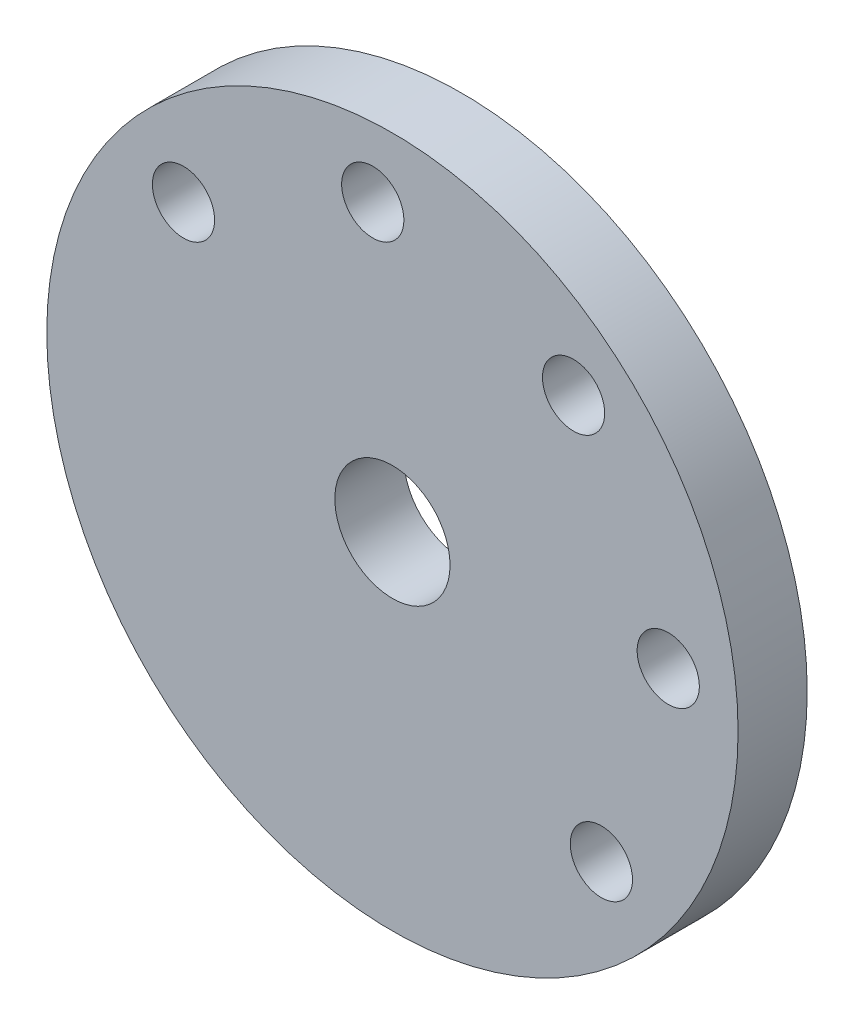
ISO-10303-21;
HEADER;
FILE_DESCRIPTION(('STEP AP214'),'2;1');
FILE_NAME('part.step','',(''),(''),'','','');
FILE_SCHEMA(('AUTOMOTIVE_DESIGN { 1 0 10303 214 1 1 1 1 }'));
ENDSEC;
DATA;
#1=APPLICATION_CONTEXT('core data for automotive mechanical design processes');
#2=APPLICATION_PROTOCOL_DEFINITION('international standard','automotive_design',2000,#1);
#3=PRODUCT_CONTEXT('',#1,'mechanical');
#4=PRODUCT('Part','Part','',(#3));
#5=PRODUCT_RELATED_PRODUCT_CATEGORY('part','',(#4));
#6=PRODUCT_DEFINITION_FORMATION('','',#4);
#7=PRODUCT_DEFINITION_CONTEXT('part definition',#1,'design');
#8=PRODUCT_DEFINITION('design','',#6,#7);
#9=PRODUCT_DEFINITION_SHAPE('','',#8);
#10=(LENGTH_UNIT() NAMED_UNIT(*) SI_UNIT(.MILLI.,.METRE.));
#11=(NAMED_UNIT(*) PLANE_ANGLE_UNIT() SI_UNIT($,.RADIAN.));
#12=(NAMED_UNIT(*) SI_UNIT($,.STERADIAN.) SOLID_ANGLE_UNIT());
#13=UNCERTAINTY_MEASURE_WITH_UNIT(LENGTH_MEASURE(1.E-05),#10,'distance_accuracy_value','');
#14=(GEOMETRIC_REPRESENTATION_CONTEXT(3) GLOBAL_UNCERTAINTY_ASSIGNED_CONTEXT((#13)) GLOBAL_UNIT_ASSIGNED_CONTEXT((#10,
#11,#12)) REPRESENTATION_CONTEXT('',''));
#15=CARTESIAN_POINT('',(0.,0.,0.));
#16=DIRECTION('',(0.,0.,1.));
#17=DIRECTION('',(1.,0.,0.));
#18=AXIS2_PLACEMENT_3D('',#15,#16,#17);
#19=CARTESIAN_POINT('',(125.,-2.77555756156289E-13,3.));
#20=DIRECTION('',(0.,0.,1.));
#21=DIRECTION('',(1.,0.,0.));
#22=AXIS2_PLACEMENT_3D('',#19,#20,#21);
#23=PLANE('',#22);
#24=CARTESIAN_POINT('',(115.93258144197,7.86014762542561,3.));
#25=DIRECTION('',(0.,0.,1.));
#26=DIRECTION('',(1.,0.,0.));
#27=AXIS2_PLACEMENT_3D('',#24,#25,#26);
#28=CIRCLE('',#27,1.34999999999999);
#29=CARTESIAN_POINT('',(117.28258144197,7.86014762542561,3.));
#30=VERTEX_POINT('',#29);
#31=EDGE_CURVE('E73',#30,#30,#28,.T.);
#32=ORIENTED_EDGE('',*,*,#31,.F.);
#33=EDGE_LOOP('',(#32));
#34=FACE_BOUND('',#33,.T.);
#35=CARTESIAN_POINT('',(134.067418558031,-7.86014762542596,3.));
#36=DIRECTION('',(0.,0.,1.));
#37=DIRECTION('',(1.,0.,0.));
#38=AXIS2_PLACEMENT_3D('',#35,#36,#37);
#39=CIRCLE('',#38,1.35);
#40=CARTESIAN_POINT('',(135.417418558031,-7.86014762542596,3.));
#41=VERTEX_POINT('',#40);
#42=EDGE_CURVE('E61',#41,#41,#39,.T.);
#43=ORIENTED_EDGE('',*,*,#42,.F.);
#44=EDGE_LOOP('',(#43));
#45=FACE_BOUND('',#44,.T.);
#46=CARTESIAN_POINT('',(132.860147625426,9.0674185580302,3.));
#47=DIRECTION('',(0.,0.,1.));
#48=DIRECTION('',(1.,0.,0.));
#49=AXIS2_PLACEMENT_3D('',#46,#47,#48);
#50=CIRCLE('',#49,1.35);
#51=CARTESIAN_POINT('',(134.210147625426,9.0674185580302,3.));
#52=VERTEX_POINT('',#51);
#53=EDGE_CURVE('E50',#52,#52,#50,.T.);
#54=ORIENTED_EDGE('',*,*,#53,.F.);
#55=EDGE_LOOP('',(#54));
#56=FACE_BOUND('',#55,.T.);
#57=CARTESIAN_POINT('',(125.,-2.77555756156289E-13,3.));
#58=DIRECTION('',(0.,0.,1.));
#59=DIRECTION('',(1.,0.,0.));
#60=AXIS2_PLACEMENT_3D('',#57,#58,#59);
#61=CIRCLE('',#60,15.0000000000021);
#62=CARTESIAN_POINT('',(140.000000000002,-2.77555756156289E-13,3.));
#63=VERTEX_POINT('',#62);
#64=EDGE_CURVE('E10',#63,#63,#61,.T.);
#65=ORIENTED_EDGE('',*,*,#64,.T.);
#66=EDGE_LOOP('',(#65));
#67=FACE_BOUND('',#66,.T.);
#68=CARTESIAN_POINT('',(136.969596837306,0.853669463173938,3.));
#69=DIRECTION('',(0.,0.,1.));
#70=DIRECTION('',(1.,0.,0.));
#71=AXIS2_PLACEMENT_3D('',#68,#69,#70);
#72=CIRCLE('',#71,1.35);
#73=CARTESIAN_POINT('',(138.319596837306,0.853669463173938,3.));
#74=VERTEX_POINT('',#73);
#75=EDGE_CURVE('E55',#74,#74,#72,.T.);
#76=ORIENTED_EDGE('',*,*,#75,.F.);
#77=EDGE_LOOP('',(#76));
#78=FACE_BOUND('',#77,.T.);
#79=CARTESIAN_POINT('',(124.146330536826,11.9695968373058,3.));
#80=DIRECTION('',(0.,0.,1.));
#81=DIRECTION('',(1.,0.,0.));
#82=AXIS2_PLACEMENT_3D('',#79,#80,#81);
#83=CIRCLE('',#82,1.34999999999999);
#84=CARTESIAN_POINT('',(125.496330536826,11.9695968373058,3.));
#85=VERTEX_POINT('',#84);
#86=EDGE_CURVE('E67',#85,#85,#83,.T.);
#87=ORIENTED_EDGE('',*,*,#86,.F.);
#88=EDGE_LOOP('',(#87));
#89=FACE_BOUND('',#88,.T.);
#90=CARTESIAN_POINT('',(125.,-2.77555756156289E-13,3.));
#91=DIRECTION('',(0.,0.,1.));
#92=DIRECTION('',(1.,0.,0.));
#93=AXIS2_PLACEMENT_3D('',#90,#91,#92);
#94=CIRCLE('',#93,2.5);
#95=CARTESIAN_POINT('',(127.5,-2.77555756156289E-13,3.));
#96=VERTEX_POINT('',#95);
#97=EDGE_CURVE('E79',#96,#96,#94,.T.);
#98=ORIENTED_EDGE('',*,*,#97,.F.);
#99=EDGE_LOOP('',(#98));
#100=FACE_BOUND('',#99,.T.);
#101=ADVANCED_FACE('F39',(#34,#45,#56,#67,#78,#89,#100),#23,.T.);
#102=CARTESIAN_POINT('',(125.,-2.77555756156289E-13,0.));
#103=DIRECTION('',(0.,0.,1.));
#104=DIRECTION('',(1.,0.,0.));
#105=AXIS2_PLACEMENT_3D('',#102,#103,#104);
#106=PLANE('',#105);
#107=CARTESIAN_POINT('',(125.,-2.77555756156289E-13,0.));
#108=DIRECTION('',(0.,0.,1.));
#109=DIRECTION('',(1.,0.,0.));
#110=AXIS2_PLACEMENT_3D('',#107,#108,#109);
#111=CIRCLE('',#110,15.0000000000021);
#112=CARTESIAN_POINT('',(140.000000000002,-2.77555756156289E-13,0.));
#113=VERTEX_POINT('',#112);
#114=EDGE_CURVE('E43',#113,#113,#111,.T.);
#115=ORIENTED_EDGE('',*,*,#114,.F.);
#116=EDGE_LOOP('',(#115));
#117=FACE_BOUND('',#116,.T.);
#118=CARTESIAN_POINT('',(132.860147625426,9.0674185580302,0.));
#119=DIRECTION('',(0.,0.,1.));
#120=DIRECTION('',(1.,0.,0.));
#121=AXIS2_PLACEMENT_3D('',#118,#119,#120);
#122=CIRCLE('',#121,1.35);
#123=CARTESIAN_POINT('',(134.210147625426,9.0674185580302,0.));
#124=VERTEX_POINT('',#123);
#125=EDGE_CURVE('E52',#124,#124,#122,.T.);
#126=ORIENTED_EDGE('',*,*,#125,.T.);
#127=EDGE_LOOP('',(#126));
#128=FACE_BOUND('',#127,.T.);
#129=CARTESIAN_POINT('',(136.969596837306,0.853669463173938,0.));
#130=DIRECTION('',(0.,0.,1.));
#131=DIRECTION('',(1.,0.,0.));
#132=AXIS2_PLACEMENT_3D('',#129,#130,#131);
#133=CIRCLE('',#132,1.35);
#134=CARTESIAN_POINT('',(138.319596837306,0.853669463173938,0.));
#135=VERTEX_POINT('',#134);
#136=EDGE_CURVE('E58',#135,#135,#133,.T.);
#137=ORIENTED_EDGE('',*,*,#136,.T.);
#138=EDGE_LOOP('',(#137));
#139=FACE_BOUND('',#138,.T.);
#140=CARTESIAN_POINT('',(134.067418558031,-7.86014762542596,0.));
#141=DIRECTION('',(0.,0.,1.));
#142=DIRECTION('',(1.,0.,0.));
#143=AXIS2_PLACEMENT_3D('',#140,#141,#142);
#144=CIRCLE('',#143,1.35);
#145=CARTESIAN_POINT('',(135.417418558031,-7.86014762542596,0.));
#146=VERTEX_POINT('',#145);
#147=EDGE_CURVE('E64',#146,#146,#144,.T.);
#148=ORIENTED_EDGE('',*,*,#147,.T.);
#149=EDGE_LOOP('',(#148));
#150=FACE_BOUND('',#149,.T.);
#151=CARTESIAN_POINT('',(124.146330536826,11.9695968373058,0.));
#152=DIRECTION('',(0.,0.,1.));
#153=DIRECTION('',(1.,0.,0.));
#154=AXIS2_PLACEMENT_3D('',#151,#152,#153);
#155=CIRCLE('',#154,1.34999999999999);
#156=CARTESIAN_POINT('',(125.496330536826,11.9695968373058,0.));
#157=VERTEX_POINT('',#156);
#158=EDGE_CURVE('E70',#157,#157,#155,.T.);
#159=ORIENTED_EDGE('',*,*,#158,.T.);
#160=EDGE_LOOP('',(#159));
#161=FACE_BOUND('',#160,.T.);
#162=CARTESIAN_POINT('',(115.93258144197,7.86014762542561,0.));
#163=DIRECTION('',(0.,0.,1.));
#164=DIRECTION('',(1.,0.,0.));
#165=AXIS2_PLACEMENT_3D('',#162,#163,#164);
#166=CIRCLE('',#165,1.34999999999999);
#167=CARTESIAN_POINT('',(117.28258144197,7.86014762542561,0.));
#168=VERTEX_POINT('',#167);
#169=EDGE_CURVE('E76',#168,#168,#166,.T.);
#170=ORIENTED_EDGE('',*,*,#169,.T.);
#171=EDGE_LOOP('',(#170));
#172=FACE_BOUND('',#171,.T.);
#173=CARTESIAN_POINT('',(125.,-2.77555756156289E-13,0.));
#174=DIRECTION('',(0.,0.,1.));
#175=DIRECTION('',(1.,0.,0.));
#176=AXIS2_PLACEMENT_3D('',#173,#174,#175);
#177=CIRCLE('',#176,2.5);
#178=CARTESIAN_POINT('',(127.5,-2.77555756156289E-13,0.));
#179=VERTEX_POINT('',#178);
#180=EDGE_CURVE('E82',#179,#179,#177,.T.);
#181=ORIENTED_EDGE('',*,*,#180,.T.);
#182=EDGE_LOOP('',(#181));
#183=FACE_BOUND('',#182,.T.);
#184=ADVANCED_FACE('F92',(#117,#128,#139,#150,#161,#172,#183),#106,.F.);
#185=CARTESIAN_POINT('',(125.,-2.77555756156289E-13,3.));
#186=DIRECTION('',(0.,0.,-1.));
#187=DIRECTION('',(-1.,0.,0.));
#188=AXIS2_PLACEMENT_3D('',#185,#186,#187);
#189=CYLINDRICAL_SURFACE('',#188,15.0000000000021);
#190=ORIENTED_EDGE('',*,*,#64,.F.);
#191=EDGE_LOOP('',(#190));
#192=FACE_BOUND('',#191,.T.);
#193=ORIENTED_EDGE('',*,*,#114,.T.);
#194=EDGE_LOOP('',(#193));
#195=FACE_BOUND('',#194,.T.);
#196=ADVANCED_FACE('F41',(#192,#195),#189,.T.);
#197=CARTESIAN_POINT('',(132.860147625426,9.0674185580302,3.));
#198=DIRECTION('',(0.,0.,-1.));
#199=DIRECTION('',(-1.,0.,0.));
#200=AXIS2_PLACEMENT_3D('',#197,#198,#199);
#201=CYLINDRICAL_SURFACE('',#200,1.35);
#202=ORIENTED_EDGE('',*,*,#53,.T.);
#203=EDGE_LOOP('',(#202));
#204=FACE_BOUND('',#203,.T.);
#205=ORIENTED_EDGE('',*,*,#125,.F.);
#206=EDGE_LOOP('',(#205));
#207=FACE_BOUND('',#206,.T.);
#208=ADVANCED_FACE('F102',(#204,#207),#201,.F.);
#209=CARTESIAN_POINT('',(136.969596837306,0.853669463173938,3.));
#210=DIRECTION('',(0.,0.,-1.));
#211=DIRECTION('',(-1.,0.,0.));
#212=AXIS2_PLACEMENT_3D('',#209,#210,#211);
#213=CYLINDRICAL_SURFACE('',#212,1.35);
#214=ORIENTED_EDGE('',*,*,#75,.T.);
#215=EDGE_LOOP('',(#214));
#216=FACE_BOUND('',#215,.T.);
#217=ORIENTED_EDGE('',*,*,#136,.F.);
#218=EDGE_LOOP('',(#217));
#219=FACE_BOUND('',#218,.T.);
#220=ADVANCED_FACE('F105',(#216,#219),#213,.F.);
#221=CARTESIAN_POINT('',(134.067418558031,-7.86014762542596,3.));
#222=DIRECTION('',(0.,0.,-1.));
#223=DIRECTION('',(-1.,0.,0.));
#224=AXIS2_PLACEMENT_3D('',#221,#222,#223);
#225=CYLINDRICAL_SURFACE('',#224,1.35);
#226=ORIENTED_EDGE('',*,*,#42,.T.);
#227=EDGE_LOOP('',(#226));
#228=FACE_BOUND('',#227,.T.);
#229=ORIENTED_EDGE('',*,*,#147,.F.);
#230=EDGE_LOOP('',(#229));
#231=FACE_BOUND('',#230,.T.);
#232=ADVANCED_FACE('F109',(#228,#231),#225,.F.);
#233=CARTESIAN_POINT('',(124.146330536826,11.9695968373058,3.));
#234=DIRECTION('',(0.,0.,-1.));
#235=DIRECTION('',(-1.,0.,0.));
#236=AXIS2_PLACEMENT_3D('',#233,#234,#235);
#237=CYLINDRICAL_SURFACE('',#236,1.34999999999999);
#238=ORIENTED_EDGE('',*,*,#86,.T.);
#239=EDGE_LOOP('',(#238));
#240=FACE_BOUND('',#239,.T.);
#241=ORIENTED_EDGE('',*,*,#158,.F.);
#242=EDGE_LOOP('',(#241));
#243=FACE_BOUND('',#242,.T.);
#244=ADVANCED_FACE('F113',(#240,#243),#237,.F.);
#245=CARTESIAN_POINT('',(115.93258144197,7.86014762542561,3.));
#246=DIRECTION('',(0.,0.,-1.));
#247=DIRECTION('',(-1.,0.,0.));
#248=AXIS2_PLACEMENT_3D('',#245,#246,#247);
#249=CYLINDRICAL_SURFACE('',#248,1.34999999999999);
#250=ORIENTED_EDGE('',*,*,#31,.T.);
#251=EDGE_LOOP('',(#250));
#252=FACE_BOUND('',#251,.T.);
#253=ORIENTED_EDGE('',*,*,#169,.F.);
#254=EDGE_LOOP('',(#253));
#255=FACE_BOUND('',#254,.T.);
#256=ADVANCED_FACE('F117',(#252,#255),#249,.F.);
#257=CARTESIAN_POINT('',(125.,-2.77555756156289E-13,3.));
#258=DIRECTION('',(0.,0.,-1.));
#259=DIRECTION('',(-1.,0.,0.));
#260=AXIS2_PLACEMENT_3D('',#257,#258,#259);
#261=CYLINDRICAL_SURFACE('',#260,2.5);
#262=ORIENTED_EDGE('',*,*,#97,.T.);
#263=EDGE_LOOP('',(#262));
#264=FACE_BOUND('',#263,.T.);
#265=ORIENTED_EDGE('',*,*,#180,.F.);
#266=EDGE_LOOP('',(#265));
#267=FACE_BOUND('',#266,.T.);
#268=ADVANCED_FACE('F88',(#264,#267),#261,.F.);
#269=CLOSED_SHELL('',(#101,#184,#196,#208,#220,#232,#244,#256,#268));
#270=MANIFOLD_SOLID_BREP('B2',#269);
#271=ADVANCED_BREP_SHAPE_REPRESENTATION('',(#18,#270),#14);
#272=SHAPE_DEFINITION_REPRESENTATION(#9,#271);
ENDSEC;
END-ISO-10303-21;
